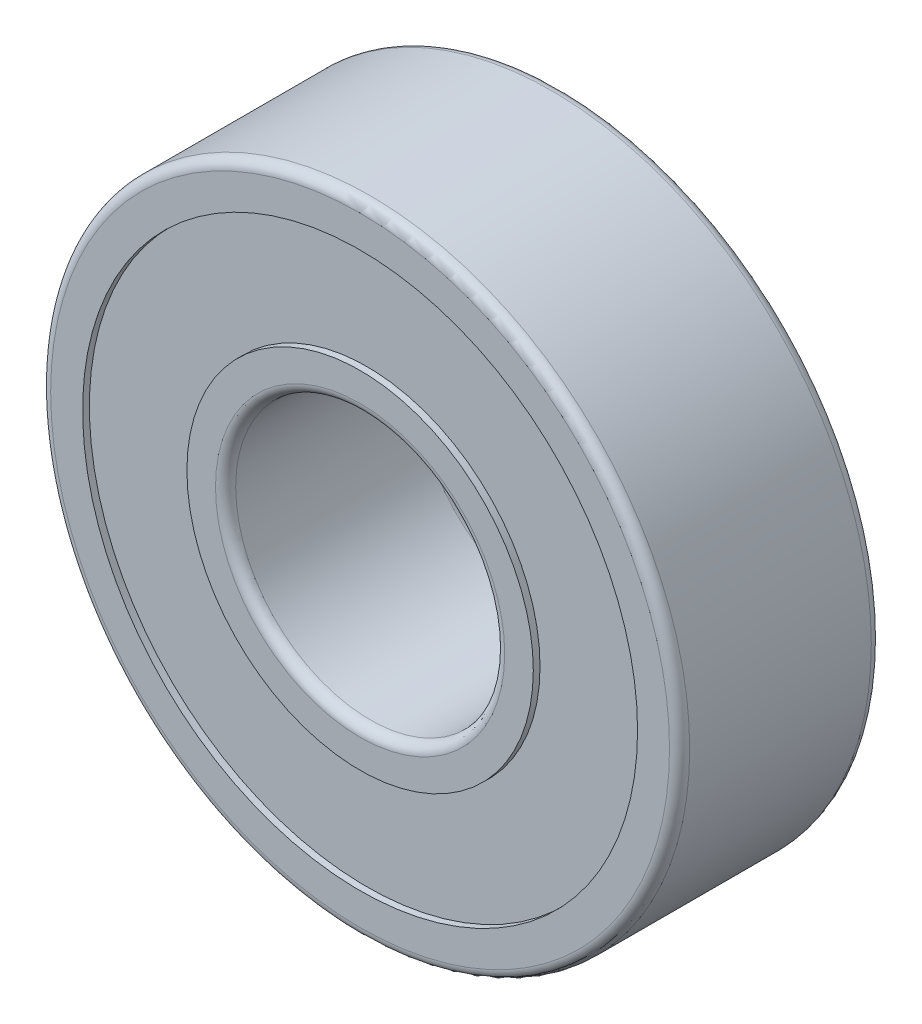
ISO-10303-21;
HEADER;
FILE_DESCRIPTION(('STEP AP214'),'2;1');
FILE_NAME('part.step','',(''),(''),'','','');
FILE_SCHEMA(('AUTOMOTIVE_DESIGN { 1 0 10303 214 1 1 1 1 }'));
ENDSEC;
DATA;
#1=APPLICATION_CONTEXT('core data for automotive mechanical design processes');
#2=APPLICATION_PROTOCOL_DEFINITION('international standard','automotive_design',2000,#1);
#3=PRODUCT_CONTEXT('',#1,'mechanical');
#4=PRODUCT('Part','Part','',(#3));
#5=PRODUCT_RELATED_PRODUCT_CATEGORY('part','',(#4));
#6=PRODUCT_DEFINITION_FORMATION('','',#4);
#7=PRODUCT_DEFINITION_CONTEXT('part definition',#1,'design');
#8=PRODUCT_DEFINITION('design','',#6,#7);
#9=PRODUCT_DEFINITION_SHAPE('','',#8);
#10=(LENGTH_UNIT() NAMED_UNIT(*) SI_UNIT(.MILLI.,.METRE.));
#11=(NAMED_UNIT(*) PLANE_ANGLE_UNIT() SI_UNIT($,.RADIAN.));
#12=(NAMED_UNIT(*) SI_UNIT($,.STERADIAN.) SOLID_ANGLE_UNIT());
#13=UNCERTAINTY_MEASURE_WITH_UNIT(LENGTH_MEASURE(1.E-05),#10,'distance_accuracy_value','');
#14=(GEOMETRIC_REPRESENTATION_CONTEXT(3) GLOBAL_UNCERTAINTY_ASSIGNED_CONTEXT((#13)) GLOBAL_UNIT_ASSIGNED_CONTEXT((#10,
#11,#12)) REPRESENTATION_CONTEXT('',''));
#15=CARTESIAN_POINT('',(0.,0.,0.));
#16=DIRECTION('',(0.,0.,1.));
#17=DIRECTION('',(1.,0.,0.));
#18=AXIS2_PLACEMENT_3D('',#15,#16,#17);
#19=CARTESIAN_POINT('',(0.,0.,-3.));
#20=DIRECTION('',(0.,0.,1.));
#21=DIRECTION('',(1.,0.,0.));
#22=AXIS2_PLACEMENT_3D('',#19,#20,#21);
#23=PLANE('',#22);
#24=CARTESIAN_POINT('',(0.,0.,-3.));
#25=DIRECTION('',(0.,0.,1.));
#26=DIRECTION('',(1.,0.,0.));
#27=AXIS2_PLACEMENT_3D('',#24,#25,#26);
#28=CIRCLE('',#27,9.2);
#29=CARTESIAN_POINT('',(9.2,0.,-3.));
#30=VERTEX_POINT('',#29);
#31=EDGE_CURVE('E39',#30,#30,#28,.F.);
#32=ORIENTED_EDGE('',*,*,#31,.T.);
#33=EDGE_LOOP('',(#32));
#34=FACE_BOUND('',#33,.T.);
#35=CARTESIAN_POINT('',(0.,0.,-3.));
#36=DIRECTION('',(0.,0.,1.));
#37=DIRECTION('',(1.,0.,0.));
#38=AXIS2_PLACEMENT_3D('',#35,#36,#37);
#39=CIRCLE('',#38,8.25);
#40=CARTESIAN_POINT('',(8.25,0.,-3.));
#41=VERTEX_POINT('',#40);
#42=EDGE_CURVE('E77',#41,#41,#39,.T.);
#43=ORIENTED_EDGE('',*,*,#42,.T.);
#44=EDGE_LOOP('',(#43));
#45=FACE_BOUND('',#44,.T.);
#46=ADVANCED_FACE('F32',(#34,#45),#23,.F.);
#47=CARTESIAN_POINT('',(0.,0.,3.));
#48=DIRECTION('',(0.,0.,1.));
#49=DIRECTION('',(1.,0.,0.));
#50=AXIS2_PLACEMENT_3D('',#47,#48,#49);
#51=PLANE('',#50);
#52=CARTESIAN_POINT('',(0.,0.,3.));
#53=DIRECTION('',(0.,0.,1.));
#54=DIRECTION('',(1.,0.,0.));
#55=AXIS2_PLACEMENT_3D('',#52,#53,#54);
#56=CIRCLE('',#55,4.3);
#57=CARTESIAN_POINT('',(4.3,0.,3.));
#58=VERTEX_POINT('',#57);
#59=EDGE_CURVE('E52',#58,#58,#56,.F.);
#60=ORIENTED_EDGE('',*,*,#59,.T.);
#61=EDGE_LOOP('',(#60));
#62=FACE_BOUND('',#61,.T.);
#63=CARTESIAN_POINT('',(0.,0.,3.));
#64=DIRECTION('',(0.,0.,1.));
#65=DIRECTION('',(1.,0.,0.));
#66=AXIS2_PLACEMENT_3D('',#63,#64,#65);
#67=CIRCLE('',#66,5.15);
#68=CARTESIAN_POINT('',(5.15,0.,3.));
#69=VERTEX_POINT('',#68);
#70=EDGE_CURVE('E71',#69,#69,#67,.T.);
#71=ORIENTED_EDGE('',*,*,#70,.T.);
#72=EDGE_LOOP('',(#71));
#73=FACE_BOUND('',#72,.T.);
#74=ADVANCED_FACE('F112',(#62,#73),#51,.T.);
#75=CARTESIAN_POINT('',(0.,0.,3.));
#76=DIRECTION('',(0.,0.,1.));
#77=DIRECTION('',(1.,0.,0.));
#78=AXIS2_PLACEMENT_3D('',#75,#76,#77);
#79=CIRCLE('',#78,9.2);
#80=CARTESIAN_POINT('',(9.2,0.,3.));
#81=VERTEX_POINT('',#80);
#82=EDGE_CURVE('E10',#81,#81,#79,.T.);
#83=ORIENTED_EDGE('',*,*,#82,.T.);
#84=EDGE_LOOP('',(#83));
#85=FACE_BOUND('',#84,.T.);
#86=CARTESIAN_POINT('',(0.,0.,3.));
#87=DIRECTION('',(0.,0.,1.));
#88=DIRECTION('',(1.,0.,0.));
#89=AXIS2_PLACEMENT_3D('',#86,#87,#88);
#90=CIRCLE('',#89,8.25);
#91=CARTESIAN_POINT('',(8.25,0.,3.));
#92=VERTEX_POINT('',#91);
#93=EDGE_CURVE('E65',#92,#92,#90,.T.);
#94=ORIENTED_EDGE('',*,*,#93,.F.);
#95=EDGE_LOOP('',(#94));
#96=FACE_BOUND('',#95,.T.);
#97=ADVANCED_FACE('F102',(#85,#96),#51,.T.);
#98=CARTESIAN_POINT('',(0.,0.,-3.));
#99=DIRECTION('',(0.,0.,1.));
#100=DIRECTION('',(1.,0.,0.));
#101=AXIS2_PLACEMENT_3D('',#98,#99,#100);
#102=CIRCLE('',#101,4.3);
#103=CARTESIAN_POINT('',(4.3,0.,-3.));
#104=VERTEX_POINT('',#103);
#105=EDGE_CURVE('E61',#104,#104,#102,.T.);
#106=ORIENTED_EDGE('',*,*,#105,.T.);
#107=EDGE_LOOP('',(#106));
#108=FACE_BOUND('',#107,.T.);
#109=CARTESIAN_POINT('',(0.,0.,-3.));
#110=DIRECTION('',(0.,0.,1.));
#111=DIRECTION('',(1.,0.,0.));
#112=AXIS2_PLACEMENT_3D('',#109,#110,#111);
#113=CIRCLE('',#112,5.15);
#114=CARTESIAN_POINT('',(5.15,0.,-3.));
#115=VERTEX_POINT('',#114);
#116=EDGE_CURVE('E83',#115,#115,#113,.T.);
#117=ORIENTED_EDGE('',*,*,#116,.F.);
#118=EDGE_LOOP('',(#117));
#119=FACE_BOUND('',#118,.T.);
#120=ADVANCED_FACE('F99',(#108,#119),#23,.F.);
#121=CARTESIAN_POINT('',(0.,0.,3.));
#122=DIRECTION('',(0.,0.,-1.));
#123=DIRECTION('',(-1.,0.,0.));
#124=AXIS2_PLACEMENT_3D('',#121,#122,#123);
#125=CYLINDRICAL_SURFACE('',#124,9.5);
#126=CARTESIAN_POINT('',(0.,0.,-2.7));
#127=DIRECTION('',(0.,0.,1.));
#128=DIRECTION('',(1.,0.,0.));
#129=AXIS2_PLACEMENT_3D('',#126,#127,#128);
#130=CIRCLE('',#129,9.5);
#131=CARTESIAN_POINT('',(9.5,0.,-2.7));
#132=VERTEX_POINT('',#131);
#133=EDGE_CURVE('E43',#132,#132,#130,.T.);
#134=ORIENTED_EDGE('',*,*,#133,.T.);
#135=EDGE_LOOP('',(#134));
#136=FACE_BOUND('',#135,.T.);
#137=CARTESIAN_POINT('',(0.,0.,2.7));
#138=DIRECTION('',(0.,0.,1.));
#139=DIRECTION('',(1.,0.,0.));
#140=AXIS2_PLACEMENT_3D('',#137,#138,#139);
#141=CIRCLE('',#140,9.5);
#142=CARTESIAN_POINT('',(9.5,0.,2.7));
#143=VERTEX_POINT('',#142);
#144=EDGE_CURVE('E47',#143,#143,#141,.F.);
#145=ORIENTED_EDGE('',*,*,#144,.T.);
#146=EDGE_LOOP('',(#145));
#147=FACE_BOUND('',#146,.T.);
#148=ADVANCED_FACE('F101',(#136,#147),#125,.T.);
#149=CARTESIAN_POINT('',(0.,0.,3.));
#150=DIRECTION('',(0.,0.,-1.));
#151=DIRECTION('',(-1.,0.,0.));
#152=AXIS2_PLACEMENT_3D('',#149,#150,#151);
#153=CYLINDRICAL_SURFACE('',#152,4.);
#154=CARTESIAN_POINT('',(0.,0.,-2.7));
#155=DIRECTION('',(0.,0.,1.));
#156=DIRECTION('',(1.,0.,0.));
#157=AXIS2_PLACEMENT_3D('',#154,#155,#156);
#158=CIRCLE('',#157,4.);
#159=CARTESIAN_POINT('',(4.,0.,-2.7));
#160=VERTEX_POINT('',#159);
#161=EDGE_CURVE('E55',#160,#160,#158,.F.);
#162=ORIENTED_EDGE('',*,*,#161,.T.);
#163=EDGE_LOOP('',(#162));
#164=FACE_BOUND('',#163,.T.);
#165=CARTESIAN_POINT('',(0.,0.,2.7));
#166=DIRECTION('',(0.,0.,1.));
#167=DIRECTION('',(1.,0.,0.));
#168=AXIS2_PLACEMENT_3D('',#165,#166,#167);
#169=CIRCLE('',#168,4.);
#170=CARTESIAN_POINT('',(4.,0.,2.7));
#171=VERTEX_POINT('',#170);
#172=EDGE_CURVE('E58',#171,#171,#169,.T.);
#173=ORIENTED_EDGE('',*,*,#172,.T.);
#174=EDGE_LOOP('',(#173));
#175=FACE_BOUND('',#174,.T.);
#176=ADVANCED_FACE('F109',(#164,#175),#153,.F.);
#177=CARTESIAN_POINT('',(0.,0.,2.8));
#178=DIRECTION('',(0.,0.,1.));
#179=DIRECTION('',(1.,0.,0.));
#180=AXIS2_PLACEMENT_3D('',#177,#178,#179);
#181=CYLINDRICAL_SURFACE('',#180,8.25);
#182=CARTESIAN_POINT('',(0.,0.,2.8));
#183=DIRECTION('',(0.,0.,1.));
#184=DIRECTION('',(1.,0.,0.));
#185=AXIS2_PLACEMENT_3D('',#182,#183,#184);
#186=CIRCLE('',#185,8.25);
#187=CARTESIAN_POINT('',(8.25,0.,2.8));
#188=VERTEX_POINT('',#187);
#189=EDGE_CURVE('E64',#188,#188,#186,.T.);
#190=ORIENTED_EDGE('',*,*,#189,.F.);
#191=EDGE_LOOP('',(#190));
#192=FACE_BOUND('',#191,.T.);
#193=ORIENTED_EDGE('',*,*,#93,.T.);
#194=EDGE_LOOP('',(#193));
#195=FACE_BOUND('',#194,.T.);
#196=ADVANCED_FACE('F138',(#192,#195),#181,.F.);
#197=CARTESIAN_POINT('',(0.,0.,2.8));
#198=DIRECTION('',(0.,0.,1.));
#199=DIRECTION('',(1.,0.,0.));
#200=AXIS2_PLACEMENT_3D('',#197,#198,#199);
#201=PLANE('',#200);
#202=CARTESIAN_POINT('',(0.,0.,2.8));
#203=DIRECTION('',(0.,0.,1.));
#204=DIRECTION('',(1.,0.,0.));
#205=AXIS2_PLACEMENT_3D('',#202,#203,#204);
#206=CIRCLE('',#205,5.15);
#207=CARTESIAN_POINT('',(5.15,0.,2.8));
#208=VERTEX_POINT('',#207);
#209=EDGE_CURVE('E68',#208,#208,#206,.T.);
#210=ORIENTED_EDGE('',*,*,#209,.F.);
#211=EDGE_LOOP('',(#210));
#212=FACE_BOUND('',#211,.T.);
#213=ORIENTED_EDGE('',*,*,#189,.T.);
#214=EDGE_LOOP('',(#213));
#215=FACE_BOUND('',#214,.T.);
#216=ADVANCED_FACE('F134',(#212,#215),#201,.T.);
#217=CARTESIAN_POINT('',(0.,0.,2.8));
#218=DIRECTION('',(0.,0.,1.));
#219=DIRECTION('',(1.,0.,0.));
#220=AXIS2_PLACEMENT_3D('',#217,#218,#219);
#221=CYLINDRICAL_SURFACE('',#220,5.15);
#222=ORIENTED_EDGE('',*,*,#209,.T.);
#223=EDGE_LOOP('',(#222));
#224=FACE_BOUND('',#223,.T.);
#225=ORIENTED_EDGE('',*,*,#70,.F.);
#226=EDGE_LOOP('',(#225));
#227=FACE_BOUND('',#226,.T.);
#228=ADVANCED_FACE('F128',(#224,#227),#221,.T.);
#229=CARTESIAN_POINT('',(0.,0.,-2.8));
#230=DIRECTION('',(0.,0.,-1.));
#231=DIRECTION('',(1.,0.,0.));
#232=AXIS2_PLACEMENT_3D('',#229,#230,#231);
#233=PLANE('',#232);
#234=CARTESIAN_POINT('',(0.,0.,-2.8));
#235=DIRECTION('',(0.,0.,1.));
#236=DIRECTION('',(1.,0.,0.));
#237=AXIS2_PLACEMENT_3D('',#234,#235,#236);
#238=CIRCLE('',#237,8.25);
#239=CARTESIAN_POINT('',(8.25,0.,-2.8));
#240=VERTEX_POINT('',#239);
#241=EDGE_CURVE('E74',#240,#240,#238,.T.);
#242=ORIENTED_EDGE('',*,*,#241,.F.);
#243=EDGE_LOOP('',(#242));
#244=FACE_BOUND('',#243,.T.);
#245=CARTESIAN_POINT('',(0.,0.,-2.8));
#246=DIRECTION('',(0.,0.,1.));
#247=DIRECTION('',(1.,0.,0.));
#248=AXIS2_PLACEMENT_3D('',#245,#246,#247);
#249=CIRCLE('',#248,5.15);
#250=CARTESIAN_POINT('',(5.15,0.,-2.8));
#251=VERTEX_POINT('',#250);
#252=EDGE_CURVE('E80',#251,#251,#249,.T.);
#253=ORIENTED_EDGE('',*,*,#252,.T.);
#254=EDGE_LOOP('',(#253));
#255=FACE_BOUND('',#254,.T.);
#256=ADVANCED_FACE('F89',(#244,#255),#233,.T.);
#257=CARTESIAN_POINT('',(0.,0.,-2.8));
#258=DIRECTION('',(0.,0.,-1.));
#259=DIRECTION('',(-1.,0.,0.));
#260=AXIS2_PLACEMENT_3D('',#257,#258,#259);
#261=CYLINDRICAL_SURFACE('',#260,8.25);
#262=ORIENTED_EDGE('',*,*,#241,.T.);
#263=EDGE_LOOP('',(#262));
#264=FACE_BOUND('',#263,.T.);
#265=ORIENTED_EDGE('',*,*,#42,.F.);
#266=EDGE_LOOP('',(#265));
#267=FACE_BOUND('',#266,.T.);
#268=ADVANCED_FACE('F95',(#264,#267),#261,.F.);
#269=CARTESIAN_POINT('',(0.,0.,-2.8));
#270=DIRECTION('',(0.,0.,-1.));
#271=DIRECTION('',(-1.,0.,0.));
#272=AXIS2_PLACEMENT_3D('',#269,#270,#271);
#273=CYLINDRICAL_SURFACE('',#272,5.15);
#274=ORIENTED_EDGE('',*,*,#252,.F.);
#275=EDGE_LOOP('',(#274));
#276=FACE_BOUND('',#275,.T.);
#277=ORIENTED_EDGE('',*,*,#116,.T.);
#278=EDGE_LOOP('',(#277));
#279=FACE_BOUND('',#278,.T.);
#280=ADVANCED_FACE('F91',(#276,#279),#273,.T.);
#281=CARTESIAN_POINT('',(0.,0.,-2.7));
#282=DIRECTION('',(0.,0.,1.));
#283=DIRECTION('',(1.,0.,0.));
#284=AXIS2_PLACEMENT_3D('',#281,#282,#283);
#285=TOROIDAL_SURFACE('',#284,4.3,0.3);
#286=ORIENTED_EDGE('',*,*,#161,.F.);
#287=EDGE_LOOP('',(#286));
#288=FACE_BOUND('',#287,.T.);
#289=ORIENTED_EDGE('',*,*,#105,.F.);
#290=EDGE_LOOP('',(#289));
#291=FACE_BOUND('',#290,.T.);
#292=ADVANCED_FACE('F94',(#288,#291),#285,.T.);
#293=CARTESIAN_POINT('',(0.,0.,2.7));
#294=DIRECTION('',(0.,0.,1.));
#295=DIRECTION('',(1.,0.,0.));
#296=AXIS2_PLACEMENT_3D('',#293,#294,#295);
#297=TOROIDAL_SURFACE('',#296,4.3,0.3);
#298=ORIENTED_EDGE('',*,*,#59,.F.);
#299=EDGE_LOOP('',(#298));
#300=FACE_BOUND('',#299,.T.);
#301=ORIENTED_EDGE('',*,*,#172,.F.);
#302=EDGE_LOOP('',(#301));
#303=FACE_BOUND('',#302,.T.);
#304=ADVANCED_FACE('F151',(#300,#303),#297,.T.);
#305=CARTESIAN_POINT('',(0.,0.,-2.7));
#306=DIRECTION('',(0.,0.,1.));
#307=DIRECTION('',(1.,0.,0.));
#308=AXIS2_PLACEMENT_3D('',#305,#306,#307);
#309=TOROIDAL_SURFACE('',#308,9.2,0.3);
#310=ORIENTED_EDGE('',*,*,#31,.F.);
#311=EDGE_LOOP('',(#310));
#312=FACE_BOUND('',#311,.T.);
#313=ORIENTED_EDGE('',*,*,#133,.F.);
#314=EDGE_LOOP('',(#313));
#315=FACE_BOUND('',#314,.T.);
#316=ADVANCED_FACE('F153',(#312,#315),#309,.T.);
#317=CARTESIAN_POINT('',(0.,0.,2.7));
#318=DIRECTION('',(0.,0.,1.));
#319=DIRECTION('',(1.,0.,0.));
#320=AXIS2_PLACEMENT_3D('',#317,#318,#319);
#321=TOROIDAL_SURFACE('',#320,9.2,0.3);
#322=ORIENTED_EDGE('',*,*,#144,.F.);
#323=EDGE_LOOP('',(#322));
#324=FACE_BOUND('',#323,.T.);
#325=ORIENTED_EDGE('',*,*,#82,.F.);
#326=EDGE_LOOP('',(#325));
#327=FACE_BOUND('',#326,.T.);
#328=ADVANCED_FACE('F34',(#324,#327),#321,.T.);
#329=CLOSED_SHELL('',(#46,#74,#97,#120,#148,#176,#196,#216,#228,#256,#268,#280,#292,#304,#316,#328));
#330=MANIFOLD_SOLID_BREP('B2',#329);
#331=ADVANCED_BREP_SHAPE_REPRESENTATION('',(#18,#330),#14);
#332=SHAPE_DEFINITION_REPRESENTATION(#9,#331);
ENDSEC;
END-ISO-10303-21;
